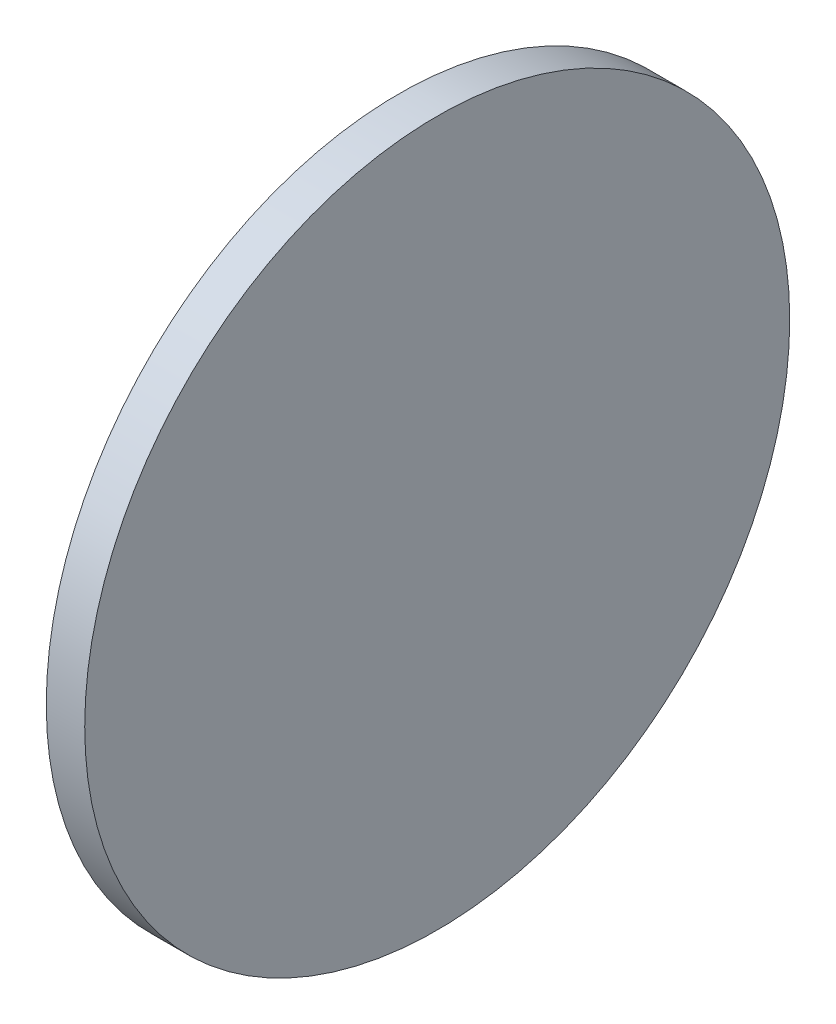
ISO-10303-21;
HEADER;
FILE_DESCRIPTION(('STEP AP214'),'2;1');
FILE_NAME('part.step','',(''),(''),'','','');
FILE_SCHEMA(('AUTOMOTIVE_DESIGN { 1 0 10303 214 1 1 1 1 }'));
ENDSEC;
DATA;
#1=APPLICATION_CONTEXT('core data for automotive mechanical design processes');
#2=APPLICATION_PROTOCOL_DEFINITION('international standard','automotive_design',2000,#1);
#3=PRODUCT_CONTEXT('',#1,'mechanical');
#4=PRODUCT('Part','Part','',(#3));
#5=PRODUCT_RELATED_PRODUCT_CATEGORY('part','',(#4));
#6=PRODUCT_DEFINITION_FORMATION('','',#4);
#7=PRODUCT_DEFINITION_CONTEXT('part definition',#1,'design');
#8=PRODUCT_DEFINITION('design','',#6,#7);
#9=PRODUCT_DEFINITION_SHAPE('','',#8);
#10=(LENGTH_UNIT() NAMED_UNIT(*) SI_UNIT(.MILLI.,.METRE.));
#11=(NAMED_UNIT(*) PLANE_ANGLE_UNIT() SI_UNIT($,.RADIAN.));
#12=(NAMED_UNIT(*) SI_UNIT($,.STERADIAN.) SOLID_ANGLE_UNIT());
#13=UNCERTAINTY_MEASURE_WITH_UNIT(LENGTH_MEASURE(1.E-05),#10,'distance_accuracy_value','');
#14=(GEOMETRIC_REPRESENTATION_CONTEXT(3) GLOBAL_UNCERTAINTY_ASSIGNED_CONTEXT((#13)) GLOBAL_UNIT_ASSIGNED_CONTEXT((#10,
#11,#12)) REPRESENTATION_CONTEXT('',''));
#15=CARTESIAN_POINT('',(0.,0.,0.));
#16=DIRECTION('',(0.,0.,1.));
#17=DIRECTION('',(1.,0.,0.));
#18=AXIS2_PLACEMENT_3D('',#15,#16,#17);
#19=CARTESIAN_POINT('',(3.04,0.,0.75));
#20=DIRECTION('',(1.,0.,0.));
#21=DIRECTION('',(0.,0.,-1.));
#22=AXIS2_PLACEMENT_3D('',#19,#20,#21);
#23=PLANE('',#22);
#24=CARTESIAN_POINT('',(3.04,0.,0.75));
#25=DIRECTION('',(1.,0.,0.));
#26=DIRECTION('',(0.,0.,-1.));
#27=AXIS2_PLACEMENT_3D('',#24,#25,#26);
#28=CIRCLE('',#27,0.550000011921);
#29=CARTESIAN_POINT('',(3.04,0.,0.199999988079));
#30=VERTEX_POINT('',#29);
#31=EDGE_CURVE('E18',#30,#30,#28,.T.);
#32=ORIENTED_EDGE('',*,*,#31,.F.);
#33=EDGE_LOOP('',(#32));
#34=FACE_BOUND('',#33,.T.);
#35=ADVANCED_FACE('F15',(#34),#23,.F.);
#36=CARTESIAN_POINT('',(3.04,0.,0.75));
#37=DIRECTION('',(1.,0.,0.));
#38=DIRECTION('',(0.,0.,-1.));
#39=AXIS2_PLACEMENT_3D('',#36,#37,#38);
#40=CYLINDRICAL_SURFACE('',#39,0.550000011921);
#41=ORIENTED_EDGE('',*,*,#31,.T.);
#42=EDGE_LOOP('',(#41));
#43=FACE_BOUND('',#42,.T.);
#44=CARTESIAN_POINT('',(3.099999998659,0.,0.75));
#45=DIRECTION('',(1.,0.,0.));
#46=DIRECTION('',(0.,0.,-1.));
#47=AXIS2_PLACEMENT_3D('',#44,#45,#46);
#48=CIRCLE('',#47,0.550000011921);
#49=CARTESIAN_POINT('',(3.099999998659,0.,0.199999988079));
#50=VERTEX_POINT('',#49);
#51=EDGE_CURVE('E10',#50,#50,#48,.T.);
#52=ORIENTED_EDGE('',*,*,#51,.F.);
#53=EDGE_LOOP('',(#52));
#54=FACE_BOUND('',#53,.T.);
#55=ADVANCED_FACE('F27',(#43,#54),#40,.T.);
#56=CARTESIAN_POINT('',(3.099999998659,0.,0.75));
#57=DIRECTION('',(1.,0.,0.));
#58=DIRECTION('',(0.,0.,-1.));
#59=AXIS2_PLACEMENT_3D('',#56,#57,#58);
#60=PLANE('',#59);
#61=ORIENTED_EDGE('',*,*,#51,.T.);
#62=EDGE_LOOP('',(#61));
#63=FACE_BOUND('',#62,.T.);
#64=ADVANCED_FACE('F35',(#63),#60,.T.);
#65=CLOSED_SHELL('',(#35,#55,#64));
#66=MANIFOLD_SOLID_BREP('B1',#65);
#67=ADVANCED_BREP_SHAPE_REPRESENTATION('',(#18,#66),#14);
#68=SHAPE_DEFINITION_REPRESENTATION(#9,#67);
ENDSEC;
END-ISO-10303-21;
